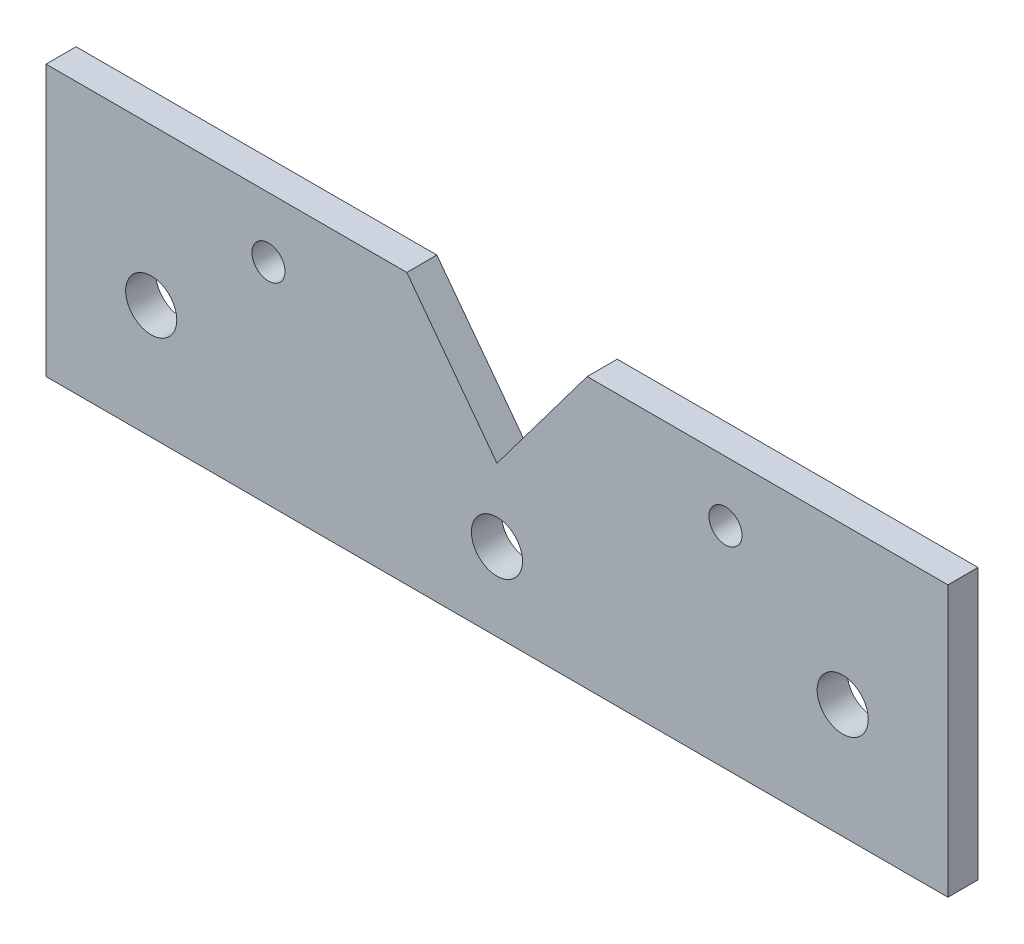
ISO-10303-21;
HEADER;
FILE_DESCRIPTION(('STEP AP214'),'2;1');
FILE_NAME('part.step','',(''),(''),'','','');
FILE_SCHEMA(('AUTOMOTIVE_DESIGN { 1 0 10303 214 1 1 1 1 }'));
ENDSEC;
DATA;
#1=APPLICATION_CONTEXT('core data for automotive mechanical design processes');
#2=APPLICATION_PROTOCOL_DEFINITION('international standard','automotive_design',2000,#1);
#3=PRODUCT_CONTEXT('',#1,'mechanical');
#4=PRODUCT('Part','Part','',(#3));
#5=PRODUCT_RELATED_PRODUCT_CATEGORY('part','',(#4));
#6=PRODUCT_DEFINITION_FORMATION('','',#4);
#7=PRODUCT_DEFINITION_CONTEXT('part definition',#1,'design');
#8=PRODUCT_DEFINITION('design','',#6,#7);
#9=PRODUCT_DEFINITION_SHAPE('','',#8);
#10=(LENGTH_UNIT() NAMED_UNIT(*) SI_UNIT(.MILLI.,.METRE.));
#11=(NAMED_UNIT(*) PLANE_ANGLE_UNIT() SI_UNIT($,.RADIAN.));
#12=(NAMED_UNIT(*) SI_UNIT($,.STERADIAN.) SOLID_ANGLE_UNIT());
#13=UNCERTAINTY_MEASURE_WITH_UNIT(LENGTH_MEASURE(1.E-05),#10,'distance_accuracy_value','');
#14=(GEOMETRIC_REPRESENTATION_CONTEXT(3) GLOBAL_UNCERTAINTY_ASSIGNED_CONTEXT((#13)) GLOBAL_UNIT_ASSIGNED_CONTEXT((#10,
#11,#12)) REPRESENTATION_CONTEXT('',''));
#15=CARTESIAN_POINT('',(0.,0.,0.));
#16=DIRECTION('',(0.,0.,1.));
#17=DIRECTION('',(1.,0.,0.));
#18=AXIS2_PLACEMENT_3D('',#15,#16,#17);
#19=CARTESIAN_POINT('',(0.,0.,5.));
#20=DIRECTION('',(0.,0.,-1.));
#21=DIRECTION('',(-1.,0.,0.));
#22=AXIS2_PLACEMENT_3D('',#19,#20,#21);
#23=PLANE('',#22);
#24=DIRECTION('',(1.,0.,0.));
#25=VECTOR('',#24,1.);
#26=CARTESIAN_POINT('',(22.5008073817762,23.5261163288845,5.));
#27=LINE('',#26,#25);
#28=CARTESIAN_POINT('',(-127.499192618224,23.5261163288845,5.));
#29=VERTEX_POINT('',#28);
#30=CARTESIAN_POINT('',(22.5008073817762,23.5261163288845,5.));
#31=VERTEX_POINT('',#30);
#32=EDGE_CURVE('E136',#29,#31,#27,.T.);
#33=ORIENTED_EDGE('',*,*,#32,.T.);
#34=DIRECTION('',(0.,1.,0.));
#35=VECTOR('',#34,1.);
#36=CARTESIAN_POINT('',(22.5008073817762,68.5261163288845,5.));
#37=LINE('',#36,#35);
#38=CARTESIAN_POINT('',(22.5008073817762,68.5261163288845,5.));
#39=VERTEX_POINT('',#38);
#40=EDGE_CURVE('E89',#31,#39,#37,.T.);
#41=ORIENTED_EDGE('',*,*,#40,.T.);
#42=DIRECTION('',(-1.,0.,0.));
#43=VECTOR('',#42,1.);
#44=CARTESIAN_POINT('',(-37.4991926182238,68.5261163288845,5.));
#45=LINE('',#44,#43);
#46=CARTESIAN_POINT('',(-37.4991926182238,68.5261163288845,5.));
#47=VERTEX_POINT('',#46);
#48=EDGE_CURVE('E148',#39,#47,#45,.T.);
#49=ORIENTED_EDGE('',*,*,#48,.T.);
#50=DIRECTION('',(-0.600000000000001,-0.8,0.));
#51=VECTOR('',#50,1.);
#52=CARTESIAN_POINT('',(-52.4991926182238,48.5261163288845,5.));
#53=LINE('',#52,#51);
#54=CARTESIAN_POINT('',(-52.4991926182238,48.5261163288845,5.));
#55=VERTEX_POINT('',#54);
#56=EDGE_CURVE('E105',#47,#55,#53,.T.);
#57=ORIENTED_EDGE('',*,*,#56,.T.);
#58=DIRECTION('',(-0.6,0.8,0.));
#59=VECTOR('',#58,1.);
#60=CARTESIAN_POINT('',(-67.4991926182237,68.5261163288845,5.));
#61=LINE('',#60,#59);
#62=CARTESIAN_POINT('',(-67.4991926182237,68.5261163288845,5.));
#63=VERTEX_POINT('',#62);
#64=EDGE_CURVE('E99',#55,#63,#61,.T.);
#65=ORIENTED_EDGE('',*,*,#64,.T.);
#66=DIRECTION('',(-1.,0.,0.));
#67=VECTOR('',#66,1.);
#68=CARTESIAN_POINT('',(-127.499192618224,68.5261163288845,5.));
#69=LINE('',#68,#67);
#70=CARTESIAN_POINT('',(-127.499192618224,68.5261163288845,5.));
#71=VERTEX_POINT('',#70);
#72=EDGE_CURVE('E103',#63,#71,#69,.T.);
#73=ORIENTED_EDGE('',*,*,#72,.T.);
#74=DIRECTION('',(0.,-1.,0.));
#75=VECTOR('',#74,1.);
#76=CARTESIAN_POINT('',(-127.499192618224,23.5261163288845,5.));
#77=LINE('',#76,#75);
#78=EDGE_CURVE('E49',#71,#29,#77,.T.);
#79=ORIENTED_EDGE('',*,*,#78,.T.);
#80=EDGE_LOOP('',(#33,#41,#49,#57,#65,#73,#79));
#81=FACE_BOUND('',#80,.T.);
#82=CARTESIAN_POINT('',(-90.4991926182237,58.5261163288845,5.));
#83=DIRECTION('',(0.,0.,1.));
#84=DIRECTION('',(1.,0.,0.));
#85=AXIS2_PLACEMENT_3D('',#82,#83,#84);
#86=CIRCLE('',#85,2.75000000000001);
#87=CARTESIAN_POINT('',(-87.7491926182237,58.5261163288845,5.));
#88=VERTEX_POINT('',#87);
#89=EDGE_CURVE('E127',#88,#88,#86,.T.);
#90=ORIENTED_EDGE('',*,*,#89,.F.);
#91=EDGE_LOOP('',(#90));
#92=FACE_BOUND('',#91,.T.);
#93=CARTESIAN_POINT('',(-14.4991926182237,58.5261163288845,5.));
#94=DIRECTION('',(0.,0.,1.));
#95=DIRECTION('',(1.,0.,0.));
#96=AXIS2_PLACEMENT_3D('',#93,#94,#95);
#97=CIRCLE('',#96,2.75);
#98=CARTESIAN_POINT('',(-11.7491926182238,58.5261163288845,5.));
#99=VERTEX_POINT('',#98);
#100=EDGE_CURVE('E163',#99,#99,#97,.T.);
#101=ORIENTED_EDGE('',*,*,#100,.F.);
#102=EDGE_LOOP('',(#101));
#103=FACE_BOUND('',#102,.T.);
#104=CARTESIAN_POINT('',(-109.999192618224,42.5261163288845,5.));
#105=DIRECTION('',(0.,0.,1.));
#106=DIRECTION('',(1.,0.,0.));
#107=AXIS2_PLACEMENT_3D('',#104,#105,#106);
#108=CIRCLE('',#107,4.24999999999999);
#109=CARTESIAN_POINT('',(-105.749192618224,42.5261163288845,5.));
#110=VERTEX_POINT('',#109);
#111=EDGE_CURVE('E169',#110,#110,#108,.T.);
#112=ORIENTED_EDGE('',*,*,#111,.F.);
#113=EDGE_LOOP('',(#112));
#114=FACE_BOUND('',#113,.T.);
#115=CARTESIAN_POINT('',(5.00080738177626,42.5261163288845,5.));
#116=DIRECTION('',(0.,0.,1.));
#117=DIRECTION('',(1.,0.,0.));
#118=AXIS2_PLACEMENT_3D('',#115,#116,#117);
#119=CIRCLE('',#118,4.25000000000001);
#120=CARTESIAN_POINT('',(9.25080738177627,42.5261163288845,5.));
#121=VERTEX_POINT('',#120);
#122=EDGE_CURVE('E175',#121,#121,#119,.T.);
#123=ORIENTED_EDGE('',*,*,#122,.F.);
#124=EDGE_LOOP('',(#123));
#125=FACE_BOUND('',#124,.T.);
#126=CARTESIAN_POINT('',(-52.4991926182238,36.5261163288845,5.));
#127=DIRECTION('',(0.,0.,1.));
#128=DIRECTION('',(1.,0.,0.));
#129=AXIS2_PLACEMENT_3D('',#126,#127,#128);
#130=CIRCLE('',#129,4.25000000000001);
#131=CARTESIAN_POINT('',(-48.2491926182237,36.5261163288845,5.));
#132=VERTEX_POINT('',#131);
#133=EDGE_CURVE('E181',#132,#132,#130,.T.);
#134=ORIENTED_EDGE('',*,*,#133,.F.);
#135=EDGE_LOOP('',(#134));
#136=FACE_BOUND('',#135,.T.);
#137=ADVANCED_FACE('F32',(#81,#92,#103,#114,#125,#136),#23,.F.);
#138=CARTESIAN_POINT('',(0.,0.,0.));
#139=DIRECTION('',(0.,0.,-1.));
#140=DIRECTION('',(-1.,0.,0.));
#141=AXIS2_PLACEMENT_3D('',#138,#139,#140);
#142=PLANE('',#141);
#143=CARTESIAN_POINT('',(5.00080738177626,42.5261163288845,0.));
#144=DIRECTION('',(0.,0.,1.));
#145=DIRECTION('',(1.,0.,0.));
#146=AXIS2_PLACEMENT_3D('',#143,#144,#145);
#147=CIRCLE('',#146,4.25000000000001);
#148=CARTESIAN_POINT('',(9.25080738177627,42.5261163288845,0.));
#149=VERTEX_POINT('',#148);
#150=EDGE_CURVE('E178',#149,#149,#147,.T.);
#151=ORIENTED_EDGE('',*,*,#150,.T.);
#152=EDGE_LOOP('',(#151));
#153=FACE_BOUND('',#152,.T.);
#154=CARTESIAN_POINT('',(-14.4991926182237,58.5261163288845,0.));
#155=DIRECTION('',(0.,0.,1.));
#156=DIRECTION('',(1.,0.,0.));
#157=AXIS2_PLACEMENT_3D('',#154,#155,#156);
#158=CIRCLE('',#157,2.75);
#159=CARTESIAN_POINT('',(-11.7491926182238,58.5261163288845,0.));
#160=VERTEX_POINT('',#159);
#161=EDGE_CURVE('E166',#160,#160,#158,.T.);
#162=ORIENTED_EDGE('',*,*,#161,.T.);
#163=EDGE_LOOP('',(#162));
#164=FACE_BOUND('',#163,.T.);
#165=DIRECTION('',(1.,0.,0.));
#166=VECTOR('',#165,1.);
#167=CARTESIAN_POINT('',(22.5008073817762,23.5261163288845,0.));
#168=LINE('',#167,#166);
#169=CARTESIAN_POINT('',(-127.499192618224,23.5261163288845,0.));
#170=VERTEX_POINT('',#169);
#171=CARTESIAN_POINT('',(22.5008073817762,23.5261163288845,0.));
#172=VERTEX_POINT('',#171);
#173=EDGE_CURVE('E123',#170,#172,#168,.T.);
#174=ORIENTED_EDGE('',*,*,#173,.F.);
#175=DIRECTION('',(0.,-1.,0.));
#176=VECTOR('',#175,1.);
#177=CARTESIAN_POINT('',(-127.499192618224,23.5261163288845,0.));
#178=LINE('',#177,#176);
#179=CARTESIAN_POINT('',(-127.499192618224,68.5261163288845,0.));
#180=VERTEX_POINT('',#179);
#181=EDGE_CURVE('E81',#180,#170,#178,.T.);
#182=ORIENTED_EDGE('',*,*,#181,.F.);
#183=DIRECTION('',(-1.,0.,0.));
#184=VECTOR('',#183,1.);
#185=CARTESIAN_POINT('',(-127.499192618224,68.5261163288845,0.));
#186=LINE('',#185,#184);
#187=CARTESIAN_POINT('',(-67.4991926182237,68.5261163288845,0.));
#188=VERTEX_POINT('',#187);
#189=EDGE_CURVE('E75',#188,#180,#186,.T.);
#190=ORIENTED_EDGE('',*,*,#189,.F.);
#191=DIRECTION('',(-0.6,0.8,0.));
#192=VECTOR('',#191,1.);
#193=CARTESIAN_POINT('',(-67.4991926182237,68.5261163288845,0.));
#194=LINE('',#193,#192);
#195=CARTESIAN_POINT('',(-52.4991926182238,48.5261163288845,0.));
#196=VERTEX_POINT('',#195);
#197=EDGE_CURVE('E113',#196,#188,#194,.T.);
#198=ORIENTED_EDGE('',*,*,#197,.F.);
#199=DIRECTION('',(-0.600000000000001,-0.8,0.));
#200=VECTOR('',#199,1.);
#201=CARTESIAN_POINT('',(-52.4991926182238,48.5261163288845,0.));
#202=LINE('',#201,#200);
#203=CARTESIAN_POINT('',(-37.4991926182238,68.5261163288845,0.));
#204=VERTEX_POINT('',#203);
#205=EDGE_CURVE('E131',#204,#196,#202,.T.);
#206=ORIENTED_EDGE('',*,*,#205,.F.);
#207=DIRECTION('',(-1.,0.,0.));
#208=VECTOR('',#207,1.);
#209=CARTESIAN_POINT('',(-37.4991926182238,68.5261163288845,0.));
#210=LINE('',#209,#208);
#211=CARTESIAN_POINT('',(22.5008073817762,68.5261163288845,0.));
#212=VERTEX_POINT('',#211);
#213=EDGE_CURVE('E129',#212,#204,#210,.T.);
#214=ORIENTED_EDGE('',*,*,#213,.F.);
#215=DIRECTION('',(0.,1.,0.));
#216=VECTOR('',#215,1.);
#217=CARTESIAN_POINT('',(22.5008073817762,68.5261163288845,0.));
#218=LINE('',#217,#216);
#219=EDGE_CURVE('E126',#172,#212,#218,.T.);
#220=ORIENTED_EDGE('',*,*,#219,.F.);
#221=EDGE_LOOP('',(#174,#182,#190,#198,#206,#214,#220));
#222=FACE_BOUND('',#221,.T.);
#223=CARTESIAN_POINT('',(-90.4991926182237,58.5261163288845,0.));
#224=DIRECTION('',(0.,0.,1.));
#225=DIRECTION('',(1.,0.,0.));
#226=AXIS2_PLACEMENT_3D('',#223,#224,#225);
#227=CIRCLE('',#226,2.75000000000001);
#228=CARTESIAN_POINT('',(-87.7491926182237,58.5261163288845,0.));
#229=VERTEX_POINT('',#228);
#230=EDGE_CURVE('E160',#229,#229,#227,.T.);
#231=ORIENTED_EDGE('',*,*,#230,.T.);
#232=EDGE_LOOP('',(#231));
#233=FACE_BOUND('',#232,.T.);
#234=CARTESIAN_POINT('',(-109.999192618224,42.5261163288845,0.));
#235=DIRECTION('',(0.,0.,1.));
#236=DIRECTION('',(1.,0.,0.));
#237=AXIS2_PLACEMENT_3D('',#234,#235,#236);
#238=CIRCLE('',#237,4.24999999999999);
#239=CARTESIAN_POINT('',(-105.749192618224,42.5261163288845,0.));
#240=VERTEX_POINT('',#239);
#241=EDGE_CURVE('E172',#240,#240,#238,.T.);
#242=ORIENTED_EDGE('',*,*,#241,.T.);
#243=EDGE_LOOP('',(#242));
#244=FACE_BOUND('',#243,.T.);
#245=CARTESIAN_POINT('',(-52.4991926182238,36.5261163288845,0.));
#246=DIRECTION('',(0.,0.,1.));
#247=DIRECTION('',(1.,0.,0.));
#248=AXIS2_PLACEMENT_3D('',#245,#246,#247);
#249=CIRCLE('',#248,4.25000000000001);
#250=CARTESIAN_POINT('',(-48.2491926182237,36.5261163288845,0.));
#251=VERTEX_POINT('',#250);
#252=EDGE_CURVE('E184',#251,#251,#249,.T.);
#253=ORIENTED_EDGE('',*,*,#252,.T.);
#254=EDGE_LOOP('',(#253));
#255=FACE_BOUND('',#254,.T.);
#256=ADVANCED_FACE('F152',(#153,#164,#222,#233,#244,#255),#142,.T.);
#257=CARTESIAN_POINT('',(22.5008073817762,23.5261163288845,5.));
#258=DIRECTION('',(0.,1.,0.));
#259=DIRECTION('',(0.,0.,1.));
#260=AXIS2_PLACEMENT_3D('',#257,#258,#259);
#261=PLANE('',#260);
#262=ORIENTED_EDGE('',*,*,#173,.T.);
#263=DIRECTION('',(0.,0.,-1.));
#264=VECTOR('',#263,1.);
#265=CARTESIAN_POINT('',(22.5008073817762,23.5261163288845,5.));
#266=LINE('',#265,#264);
#267=EDGE_CURVE('E11',#31,#172,#266,.T.);
#268=ORIENTED_EDGE('',*,*,#267,.F.);
#269=ORIENTED_EDGE('',*,*,#32,.F.);
#270=DIRECTION('',(0.,0.,-1.));
#271=VECTOR('',#270,1.);
#272=CARTESIAN_POINT('',(-127.499192618224,23.5261163288845,5.));
#273=LINE('',#272,#271);
#274=EDGE_CURVE('E119',#29,#170,#273,.T.);
#275=ORIENTED_EDGE('',*,*,#274,.T.);
#276=EDGE_LOOP('',(#262,#268,#269,#275));
#277=FACE_BOUND('',#276,.T.);
#278=ADVANCED_FACE('F34',(#277),#261,.F.);
#279=CARTESIAN_POINT('',(22.5008073817762,68.5261163288845,5.));
#280=DIRECTION('',(-1.,0.,0.));
#281=DIRECTION('',(0.,0.,1.));
#282=AXIS2_PLACEMENT_3D('',#279,#280,#281);
#283=PLANE('',#282);
#284=ORIENTED_EDGE('',*,*,#219,.T.);
#285=DIRECTION('',(0.,0.,-1.));
#286=VECTOR('',#285,1.);
#287=CARTESIAN_POINT('',(22.5008073817762,68.5261163288845,5.));
#288=LINE('',#287,#286);
#289=EDGE_CURVE('E41',#39,#212,#288,.T.);
#290=ORIENTED_EDGE('',*,*,#289,.F.);
#291=ORIENTED_EDGE('',*,*,#40,.F.);
#292=ORIENTED_EDGE('',*,*,#267,.T.);
#293=EDGE_LOOP('',(#284,#290,#291,#292));
#294=FACE_BOUND('',#293,.T.);
#295=ADVANCED_FACE('F214',(#294),#283,.F.);
#296=CARTESIAN_POINT('',(-37.4991926182238,68.5261163288845,5.));
#297=DIRECTION('',(0.,-1.,0.));
#298=DIRECTION('',(0.,0.,-1.));
#299=AXIS2_PLACEMENT_3D('',#296,#297,#298);
#300=PLANE('',#299);
#301=ORIENTED_EDGE('',*,*,#213,.T.);
#302=DIRECTION('',(0.,0.,-1.));
#303=VECTOR('',#302,1.);
#304=CARTESIAN_POINT('',(-37.4991926182238,68.5261163288845,5.));
#305=LINE('',#304,#303);
#306=EDGE_CURVE('E140',#47,#204,#305,.T.);
#307=ORIENTED_EDGE('',*,*,#306,.F.);
#308=ORIENTED_EDGE('',*,*,#48,.F.);
#309=ORIENTED_EDGE('',*,*,#289,.T.);
#310=EDGE_LOOP('',(#301,#307,#308,#309));
#311=FACE_BOUND('',#310,.T.);
#312=ADVANCED_FACE('F146',(#311),#300,.F.);
#313=CARTESIAN_POINT('',(-52.4991926182238,48.5261163288845,5.));
#314=DIRECTION('',(0.8,-0.600000000000001,0.));
#315=DIRECTION('',(0.600000000000001,0.8,0.));
#316=AXIS2_PLACEMENT_3D('',#313,#314,#315);
#317=PLANE('',#316);
#318=ORIENTED_EDGE('',*,*,#205,.T.);
#319=DIRECTION('',(0.,0.,-1.));
#320=VECTOR('',#319,1.);
#321=CARTESIAN_POINT('',(-52.4991926182238,48.5261163288845,5.));
#322=LINE('',#321,#320);
#323=EDGE_CURVE('E114',#55,#196,#322,.T.);
#324=ORIENTED_EDGE('',*,*,#323,.F.);
#325=ORIENTED_EDGE('',*,*,#56,.F.);
#326=ORIENTED_EDGE('',*,*,#306,.T.);
#327=EDGE_LOOP('',(#318,#324,#325,#326));
#328=FACE_BOUND('',#327,.T.);
#329=ADVANCED_FACE('F155',(#328),#317,.F.);
#330=CARTESIAN_POINT('',(-67.4991926182237,68.5261163288845,5.));
#331=DIRECTION('',(-0.8,-0.6,0.));
#332=DIRECTION('',(0.6,-0.8,0.));
#333=AXIS2_PLACEMENT_3D('',#330,#331,#332);
#334=PLANE('',#333);
#335=ORIENTED_EDGE('',*,*,#197,.T.);
#336=DIRECTION('',(0.,0.,-1.));
#337=VECTOR('',#336,1.);
#338=CARTESIAN_POINT('',(-67.4991926182237,68.5261163288845,5.));
#339=LINE('',#338,#337);
#340=EDGE_CURVE('E110',#63,#188,#339,.T.);
#341=ORIENTED_EDGE('',*,*,#340,.F.);
#342=ORIENTED_EDGE('',*,*,#64,.F.);
#343=ORIENTED_EDGE('',*,*,#323,.T.);
#344=EDGE_LOOP('',(#335,#341,#342,#343));
#345=FACE_BOUND('',#344,.T.);
#346=ADVANCED_FACE('F111',(#345),#334,.F.);
#347=CARTESIAN_POINT('',(-127.499192618224,68.5261163288845,5.));
#348=DIRECTION('',(0.,-1.,0.));
#349=DIRECTION('',(0.,0.,-1.));
#350=AXIS2_PLACEMENT_3D('',#347,#348,#349);
#351=PLANE('',#350);
#352=ORIENTED_EDGE('',*,*,#189,.T.);
#353=DIRECTION('',(0.,0.,-1.));
#354=VECTOR('',#353,1.);
#355=CARTESIAN_POINT('',(-127.499192618224,68.5261163288845,5.));
#356=LINE('',#355,#354);
#357=EDGE_CURVE('E115',#71,#180,#356,.T.);
#358=ORIENTED_EDGE('',*,*,#357,.F.);
#359=ORIENTED_EDGE('',*,*,#72,.F.);
#360=ORIENTED_EDGE('',*,*,#340,.T.);
#361=EDGE_LOOP('',(#352,#358,#359,#360));
#362=FACE_BOUND('',#361,.T.);
#363=ADVANCED_FACE('F117',(#362),#351,.F.);
#364=CARTESIAN_POINT('',(-127.499192618224,23.5261163288845,5.));
#365=DIRECTION('',(1.,0.,0.));
#366=DIRECTION('',(0.,0.,-1.));
#367=AXIS2_PLACEMENT_3D('',#364,#365,#366);
#368=PLANE('',#367);
#369=ORIENTED_EDGE('',*,*,#181,.T.);
#370=ORIENTED_EDGE('',*,*,#274,.F.);
#371=ORIENTED_EDGE('',*,*,#78,.F.);
#372=ORIENTED_EDGE('',*,*,#357,.T.);
#373=EDGE_LOOP('',(#369,#370,#371,#372));
#374=FACE_BOUND('',#373,.T.);
#375=ADVANCED_FACE('F204',(#374),#368,.F.);
#376=CARTESIAN_POINT('',(-90.4991926182237,58.5261163288845,5.));
#377=DIRECTION('',(0.,0.,-1.));
#378=DIRECTION('',(-1.,0.,0.));
#379=AXIS2_PLACEMENT_3D('',#376,#377,#378);
#380=CYLINDRICAL_SURFACE('',#379,2.75000000000001);
#381=ORIENTED_EDGE('',*,*,#89,.T.);
#382=EDGE_LOOP('',(#381));
#383=FACE_BOUND('',#382,.T.);
#384=ORIENTED_EDGE('',*,*,#230,.F.);
#385=EDGE_LOOP('',(#384));
#386=FACE_BOUND('',#385,.T.);
#387=ADVANCED_FACE('F201',(#383,#386),#380,.F.);
#388=CARTESIAN_POINT('',(-14.4991926182237,58.5261163288845,5.));
#389=DIRECTION('',(0.,0.,-1.));
#390=DIRECTION('',(-1.,0.,0.));
#391=AXIS2_PLACEMENT_3D('',#388,#389,#390);
#392=CYLINDRICAL_SURFACE('',#391,2.75);
#393=ORIENTED_EDGE('',*,*,#100,.T.);
#394=EDGE_LOOP('',(#393));
#395=FACE_BOUND('',#394,.T.);
#396=ORIENTED_EDGE('',*,*,#161,.F.);
#397=EDGE_LOOP('',(#396));
#398=FACE_BOUND('',#397,.T.);
#399=ADVANCED_FACE('F273',(#395,#398),#392,.F.);
#400=CARTESIAN_POINT('',(-109.999192618224,42.5261163288845,5.));
#401=DIRECTION('',(0.,0.,-1.));
#402=DIRECTION('',(-1.,0.,0.));
#403=AXIS2_PLACEMENT_3D('',#400,#401,#402);
#404=CYLINDRICAL_SURFACE('',#403,4.24999999999999);
#405=ORIENTED_EDGE('',*,*,#111,.T.);
#406=EDGE_LOOP('',(#405));
#407=FACE_BOUND('',#406,.T.);
#408=ORIENTED_EDGE('',*,*,#241,.F.);
#409=EDGE_LOOP('',(#408));
#410=FACE_BOUND('',#409,.T.);
#411=ADVANCED_FACE('F281',(#407,#410),#404,.F.);
#412=CARTESIAN_POINT('',(5.00080738177626,42.5261163288845,5.));
#413=DIRECTION('',(0.,0.,-1.));
#414=DIRECTION('',(-1.,0.,0.));
#415=AXIS2_PLACEMENT_3D('',#412,#413,#414);
#416=CYLINDRICAL_SURFACE('',#415,4.25000000000001);
#417=ORIENTED_EDGE('',*,*,#122,.T.);
#418=EDGE_LOOP('',(#417));
#419=FACE_BOUND('',#418,.T.);
#420=ORIENTED_EDGE('',*,*,#150,.F.);
#421=EDGE_LOOP('',(#420));
#422=FACE_BOUND('',#421,.T.);
#423=ADVANCED_FACE('F289',(#419,#422),#416,.F.);
#424=CARTESIAN_POINT('',(-52.4991926182238,36.5261163288845,5.));
#425=DIRECTION('',(0.,0.,-1.));
#426=DIRECTION('',(-1.,0.,0.));
#427=AXIS2_PLACEMENT_3D('',#424,#425,#426);
#428=CYLINDRICAL_SURFACE('',#427,4.25000000000001);
#429=ORIENTED_EDGE('',*,*,#133,.T.);
#430=EDGE_LOOP('',(#429));
#431=FACE_BOUND('',#430,.T.);
#432=ORIENTED_EDGE('',*,*,#252,.F.);
#433=EDGE_LOOP('',(#432));
#434=FACE_BOUND('',#433,.T.);
#435=ADVANCED_FACE('F190',(#431,#434),#428,.F.);
#436=CLOSED_SHELL('',(#137,#256,#278,#295,#312,#329,#346,#363,#375,#387,#399,#411,#423,#435));
#437=MANIFOLD_SOLID_BREP('B2',#436);
#438=ADVANCED_BREP_SHAPE_REPRESENTATION('',(#18,#437),#14);
#439=SHAPE_DEFINITION_REPRESENTATION(#9,#438);
ENDSEC;
END-ISO-10303-21;
